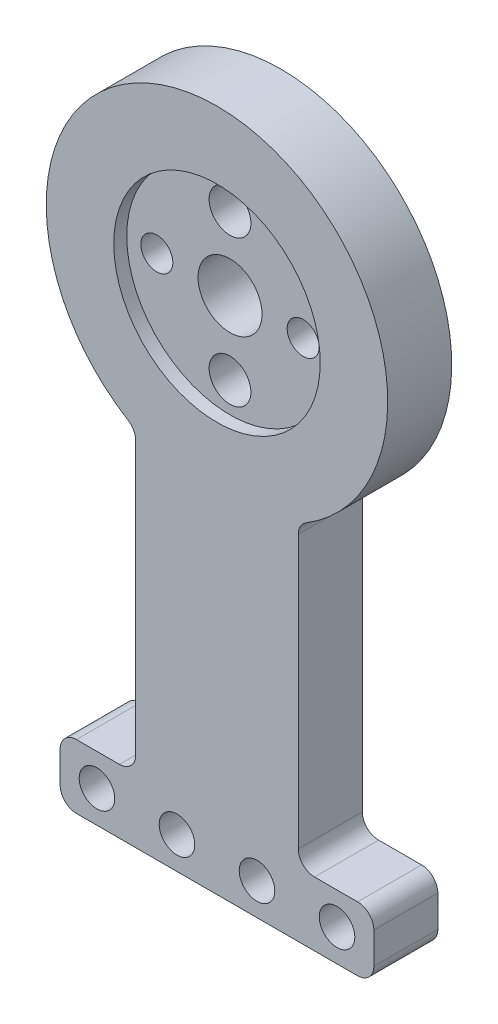
ISO-10303-21;
HEADER;
FILE_DESCRIPTION(('STEP AP214'),'2;1');
FILE_NAME('part.step','',(''),(''),'','','');
FILE_SCHEMA(('AUTOMOTIVE_DESIGN { 1 0 10303 214 1 1 1 1 }'));
ENDSEC;
DATA;
#1=APPLICATION_CONTEXT('core data for automotive mechanical design processes');
#2=APPLICATION_PROTOCOL_DEFINITION('international standard','automotive_design',2000,#1);
#3=PRODUCT_CONTEXT('',#1,'mechanical');
#4=PRODUCT('Part','Part','',(#3));
#5=PRODUCT_RELATED_PRODUCT_CATEGORY('part','',(#4));
#6=PRODUCT_DEFINITION_FORMATION('','',#4);
#7=PRODUCT_DEFINITION_CONTEXT('part definition',#1,'design');
#8=PRODUCT_DEFINITION('design','',#6,#7);
#9=PRODUCT_DEFINITION_SHAPE('','',#8);
#10=(LENGTH_UNIT() NAMED_UNIT(*) SI_UNIT(.MILLI.,.METRE.));
#11=(NAMED_UNIT(*) PLANE_ANGLE_UNIT() SI_UNIT($,.RADIAN.));
#12=(NAMED_UNIT(*) SI_UNIT($,.STERADIAN.) SOLID_ANGLE_UNIT());
#13=UNCERTAINTY_MEASURE_WITH_UNIT(LENGTH_MEASURE(1.E-05),#10,'distance_accuracy_value','');
#14=(GEOMETRIC_REPRESENTATION_CONTEXT(3) GLOBAL_UNCERTAINTY_ASSIGNED_CONTEXT((#13)) GLOBAL_UNIT_ASSIGNED_CONTEXT((#10,
#11,#12)) REPRESENTATION_CONTEXT('',''));
#15=CARTESIAN_POINT('',(0.,0.,0.));
#16=DIRECTION('',(0.,0.,1.));
#17=DIRECTION('',(1.,0.,0.));
#18=AXIS2_PLACEMENT_3D('',#15,#16,#17);
#19=CARTESIAN_POINT('',(0.,0.,-4.9999999949));
#20=DIRECTION('',(0.,0.,1.));
#21=DIRECTION('',(1.,0.,0.));
#22=AXIS2_PLACEMENT_3D('',#19,#20,#21);
#23=PLANE('',#22);
#24=CARTESIAN_POINT('',(-18.749999584,-75.009999967,-4.9999999949));
#25=DIRECTION('',(0.,0.,-1.));
#26=DIRECTION('',(-1.,0.,0.));
#27=AXIS2_PLACEMENT_3D('',#24,#25,#26);
#28=CIRCLE('',#27,2.77812499999999);
#29=CARTESIAN_POINT('',(-21.528124584,-75.009999967,-4.9999999949));
#30=VERTEX_POINT('',#29);
#31=EDGE_CURVE('E394',#30,#30,#28,.T.);
#32=ORIENTED_EDGE('',*,*,#31,.F.);
#33=EDGE_LOOP('',(#32));
#34=FACE_BOUND('',#33,.T.);
#35=DIRECTION('',(0.,1.,0.));
#36=VECTOR('',#35,1.);
#37=CARTESIAN_POINT('',(24.500000022,-80.01,-4.9999999949));
#38=LINE('',#37,#36);
#39=CARTESIAN_POINT('',(24.500000022,-77.47,-4.9999999949));
#40=VERTEX_POINT('',#39);
#41=CARTESIAN_POINT('',(24.500000022,-72.549999934,-4.9999999949));
#42=VERTEX_POINT('',#41);
#43=EDGE_CURVE('E406',#40,#42,#38,.T.);
#44=ORIENTED_EDGE('',*,*,#43,.F.);
#45=CARTESIAN_POINT('',(21.960000022,-77.47,-4.9999999949));
#46=DIRECTION('',(0.,0.,1.));
#47=DIRECTION('',(1.,0.,0.));
#48=AXIS2_PLACEMENT_3D('',#45,#46,#47);
#49=CIRCLE('',#48,2.54);
#50=CARTESIAN_POINT('',(21.960000022,-80.01,-4.9999999949));
#51=VERTEX_POINT('',#50);
#52=EDGE_CURVE('E338',#40,#51,#49,.F.);
#53=ORIENTED_EDGE('',*,*,#52,.T.);
#54=DIRECTION('',(1.,0.,0.));
#55=VECTOR('',#54,1.);
#56=CARTESIAN_POINT('',(-12.7,-80.01,-4.9999999949));
#57=LINE('',#56,#55);
#58=CARTESIAN_POINT('',(-21.960000022,-80.01,-4.9999999949));
#59=VERTEX_POINT('',#58);
#60=EDGE_CURVE('E222',#59,#51,#57,.T.);
#61=ORIENTED_EDGE('',*,*,#60,.F.);
#62=CARTESIAN_POINT('',(-21.960000022,-77.47,-4.9999999949));
#63=DIRECTION('',(0.,0.,1.));
#64=DIRECTION('',(1.,0.,0.));
#65=AXIS2_PLACEMENT_3D('',#62,#63,#64);
#66=CIRCLE('',#65,2.54);
#67=CARTESIAN_POINT('',(-24.500000022,-77.47,-4.9999999949));
#68=VERTEX_POINT('',#67);
#69=EDGE_CURVE('E336',#59,#68,#66,.F.);
#70=ORIENTED_EDGE('',*,*,#69,.T.);
#71=DIRECTION('',(0.,1.,0.));
#72=VECTOR('',#71,1.);
#73=CARTESIAN_POINT('',(-24.500000022,-80.01,-4.9999999949));
#74=LINE('',#73,#72);
#75=CARTESIAN_POINT('',(-24.500000022,-72.549999934,-4.9999999949));
#76=VERTEX_POINT('',#75);
#77=EDGE_CURVE('E405',#68,#76,#74,.T.);
#78=ORIENTED_EDGE('',*,*,#77,.T.);
#79=CARTESIAN_POINT('',(-21.960000022,-72.549999934,-4.9999999949));
#80=DIRECTION('',(0.,0.,1.));
#81=DIRECTION('',(1.,0.,0.));
#82=AXIS2_PLACEMENT_3D('',#79,#80,#81);
#83=CIRCLE('',#82,2.54);
#84=CARTESIAN_POINT('',(-21.960000022,-70.009999934,-4.9999999949));
#85=VERTEX_POINT('',#84);
#86=EDGE_CURVE('E328',#76,#85,#83,.F.);
#87=ORIENTED_EDGE('',*,*,#86,.T.);
#88=DIRECTION('',(-1.,0.,0.));
#89=VECTOR('',#88,1.);
#90=CARTESIAN_POINT('',(24.500000022,-70.009999934,-4.9999999949));
#91=LINE('',#90,#89);
#92=CARTESIAN_POINT('',(-15.24,-70.009999934,-4.9999999949));
#93=VERTEX_POINT('',#92);
#94=EDGE_CURVE('E419',#93,#85,#91,.T.);
#95=ORIENTED_EDGE('',*,*,#94,.F.);
#96=CARTESIAN_POINT('',(-15.24,-67.469999934,-4.9999999949));
#97=DIRECTION('',(0.,0.,1.));
#98=DIRECTION('',(1.,0.,0.));
#99=AXIS2_PLACEMENT_3D('',#96,#97,#98);
#100=CIRCLE('',#99,2.54);
#101=CARTESIAN_POINT('',(-12.7,-67.469999934,-4.9999999949));
#102=VERTEX_POINT('',#101);
#103=EDGE_CURVE('E53',#93,#102,#100,.T.);
#104=ORIENTED_EDGE('',*,*,#103,.T.);
#105=DIRECTION('',(0.,-1.,0.));
#106=VECTOR('',#105,1.);
#107=CARTESIAN_POINT('',(-12.7,-80.01,-4.9999999949));
#108=LINE('',#107,#106);
#109=CARTESIAN_POINT('',(-12.7,-24.9191994253427,-4.9999999949));
#110=VERTEX_POINT('',#109);
#111=EDGE_CURVE('E219',#110,#102,#108,.T.);
#112=ORIENTED_EDGE('',*,*,#111,.F.);
#113=CARTESIAN_POINT('',(-15.24,-24.9191994253427,-4.9999999949));
#114=DIRECTION('',(0.,0.,1.));
#115=DIRECTION('',(1.,0.,0.));
#116=AXIS2_PLACEMENT_3D('',#113,#114,#115);
#117=CIRCLE('',#116,2.54);
#118=CARTESIAN_POINT('',(-13.9147826086956,-22.7523125187911,-4.9999999949));
#119=VERTEX_POINT('',#118);
#120=EDGE_CURVE('E372',#110,#119,#117,.T.);
#121=ORIENTED_EDGE('',*,*,#120,.T.);
#122=CARTESIAN_POINT('',(0.,0.,-4.9999999949));
#123=DIRECTION('',(0.,0.,1.));
#124=DIRECTION('',(1.,0.,0.));
#125=AXIS2_PLACEMENT_3D('',#122,#123,#124);
#126=CIRCLE('',#125,26.67);
#127=CARTESIAN_POINT('',(13.9147826086957,-22.7523125187911,-4.9999999949));
#128=VERTEX_POINT('',#127);
#129=EDGE_CURVE('E196',#128,#119,#126,.T.);
#130=ORIENTED_EDGE('',*,*,#129,.F.);
#131=CARTESIAN_POINT('',(15.24,-24.9191994253427,-4.9999999949));
#132=DIRECTION('',(0.,0.,1.));
#133=DIRECTION('',(1.,0.,0.));
#134=AXIS2_PLACEMENT_3D('',#131,#132,#133);
#135=CIRCLE('',#134,2.54);
#136=CARTESIAN_POINT('',(12.7,-24.9191994253427,-4.9999999949));
#137=VERTEX_POINT('',#136);
#138=EDGE_CURVE('E368',#128,#137,#135,.T.);
#139=ORIENTED_EDGE('',*,*,#138,.T.);
#140=DIRECTION('',(0.,1.,0.));
#141=VECTOR('',#140,1.);
#142=CARTESIAN_POINT('',(12.7,-80.01,-4.9999999949));
#143=LINE('',#142,#141);
#144=CARTESIAN_POINT('',(12.7,-67.469999934,-4.9999999949));
#145=VERTEX_POINT('',#144);
#146=EDGE_CURVE('E208',#145,#137,#143,.T.);
#147=ORIENTED_EDGE('',*,*,#146,.F.);
#148=CARTESIAN_POINT('',(15.24,-67.469999934,-4.9999999949));
#149=DIRECTION('',(0.,0.,1.));
#150=DIRECTION('',(1.,0.,0.));
#151=AXIS2_PLACEMENT_3D('',#148,#149,#150);
#152=CIRCLE('',#151,2.54);
#153=CARTESIAN_POINT('',(15.24,-70.009999934,-4.9999999949));
#154=VERTEX_POINT('',#153);
#155=EDGE_CURVE('E378',#145,#154,#152,.T.);
#156=ORIENTED_EDGE('',*,*,#155,.T.);
#157=CARTESIAN_POINT('',(21.960000022,-70.009999934,-4.9999999949));
#158=VERTEX_POINT('',#157);
#159=EDGE_CURVE('E189',#158,#154,#91,.T.);
#160=ORIENTED_EDGE('',*,*,#159,.F.);
#161=CARTESIAN_POINT('',(21.960000022,-72.549999934,-4.9999999949));
#162=DIRECTION('',(0.,0.,1.));
#163=DIRECTION('',(1.,0.,0.));
#164=AXIS2_PLACEMENT_3D('',#161,#162,#163);
#165=CIRCLE('',#164,2.54);
#166=EDGE_CURVE('E335',#158,#42,#165,.F.);
#167=ORIENTED_EDGE('',*,*,#166,.T.);
#168=EDGE_LOOP('',(#44,#53,#61,#70,#78,#87,#95,#104,#112,#121,#130,#139,#147,#156,#160,#167));
#169=FACE_BOUND('',#168,.T.);
#170=CARTESIAN_POINT('',(0.,11.43,-4.9999999949));
#171=DIRECTION('',(0.,0.,-1.));
#172=DIRECTION('',(-1.,0.,0.));
#173=AXIS2_PLACEMENT_3D('',#170,#171,#172);
#174=CIRCLE('',#173,6.4389);
#175=CARTESIAN_POINT('',(-0.189748286826541,4.9938964584427,-4.9999999949));
#176=VERTEX_POINT('',#175);
#177=CARTESIAN_POINT('',(0.189748286826521,4.9938964584427,-4.9999999949));
#178=VERTEX_POINT('',#177);
#179=EDGE_CURVE('E174',#176,#178,#174,.T.);
#180=ORIENTED_EDGE('',*,*,#179,.F.);
#181=CARTESIAN_POINT('',(0.,0.,-4.9999999949));
#182=DIRECTION('',(0.,0.,1.));
#183=DIRECTION('',(1.,0.,0.));
#184=AXIS2_PLACEMENT_3D('',#181,#182,#183);
#185=CIRCLE('',#184,4.9975);
#186=CARTESIAN_POINT('',(-0.189748286826061,-4.99389645844269,-4.9999999949));
#187=VERTEX_POINT('',#186);
#188=EDGE_CURVE('E185',#176,#187,#185,.T.);
#189=ORIENTED_EDGE('',*,*,#188,.T.);
#190=CARTESIAN_POINT('',(0.,-11.43,-4.9999999949));
#191=DIRECTION('',(0.,0.,-1.));
#192=DIRECTION('',(-1.,0.,0.));
#193=AXIS2_PLACEMENT_3D('',#190,#191,#192);
#194=CIRCLE('',#193,6.4389);
#195=CARTESIAN_POINT('',(0.189748286826063,-4.99389645844269,-4.9999999949));
#196=VERTEX_POINT('',#195);
#197=EDGE_CURVE('E424',#196,#187,#194,.T.);
#198=ORIENTED_EDGE('',*,*,#197,.F.);
#199=EDGE_CURVE('E187',#196,#178,#185,.T.);
#200=ORIENTED_EDGE('',*,*,#199,.T.);
#201=EDGE_LOOP('',(#180,#189,#198,#200));
#202=FACE_BOUND('',#201,.T.);
#203=CARTESIAN_POINT('',(-11.43,0.,-4.9999999949));
#204=DIRECTION('',(0.,0.,-1.));
#205=DIRECTION('',(-1.,0.,0.));
#206=AXIS2_PLACEMENT_3D('',#203,#204,#205);
#207=CIRCLE('',#206,2.5);
#208=CARTESIAN_POINT('',(-13.93,0.,-4.9999999949));
#209=VERTEX_POINT('',#208);
#210=EDGE_CURVE('E435',#209,#209,#207,.T.);
#211=ORIENTED_EDGE('',*,*,#210,.F.);
#212=EDGE_LOOP('',(#211));
#213=FACE_BOUND('',#212,.T.);
#214=CARTESIAN_POINT('',(11.43,0.,-4.9999999949));
#215=DIRECTION('',(0.,0.,-1.));
#216=DIRECTION('',(-1.,0.,0.));
#217=AXIS2_PLACEMENT_3D('',#214,#215,#216);
#218=CIRCLE('',#217,2.5);
#219=CARTESIAN_POINT('',(8.93,0.,-4.9999999949));
#220=VERTEX_POINT('',#219);
#221=EDGE_CURVE('E429',#220,#220,#218,.T.);
#222=ORIENTED_EDGE('',*,*,#221,.F.);
#223=EDGE_LOOP('',(#222));
#224=FACE_BOUND('',#223,.T.);
#225=CARTESIAN_POINT('',(18.750000092,-75.009999967,-4.9999999949));
#226=DIRECTION('',(0.,0.,-1.));
#227=DIRECTION('',(-1.,0.,0.));
#228=AXIS2_PLACEMENT_3D('',#225,#226,#227);
#229=CIRCLE('',#228,2.77812499999999);
#230=CARTESIAN_POINT('',(15.971875092,-75.009999967,-4.9999999949));
#231=VERTEX_POINT('',#230);
#232=EDGE_CURVE('E399',#231,#231,#229,.T.);
#233=ORIENTED_EDGE('',*,*,#232,.F.);
#234=EDGE_LOOP('',(#233));
#235=FACE_BOUND('',#234,.T.);
#236=CARTESIAN_POINT('',(6.2500002,-75.009999967,-4.9999999949));
#237=DIRECTION('',(0.,0.,-1.));
#238=DIRECTION('',(-1.,0.,0.));
#239=AXIS2_PLACEMENT_3D('',#236,#237,#238);
#240=CIRCLE('',#239,2.77812499999999);
#241=CARTESIAN_POINT('',(3.47187520000001,-75.009999967,-4.9999999949));
#242=VERTEX_POINT('',#241);
#243=EDGE_CURVE('E382',#242,#242,#240,.T.);
#244=ORIENTED_EDGE('',*,*,#243,.F.);
#245=EDGE_LOOP('',(#244));
#246=FACE_BOUND('',#245,.T.);
#247=CARTESIAN_POINT('',(-6.249999692,-75.009999967,-4.9999999949));
#248=DIRECTION('',(0.,0.,-1.));
#249=DIRECTION('',(-1.,0.,0.));
#250=AXIS2_PLACEMENT_3D('',#247,#248,#249);
#251=CIRCLE('',#250,2.77812499999999);
#252=CARTESIAN_POINT('',(-9.02812469199999,-75.009999967,-4.9999999949));
#253=VERTEX_POINT('',#252);
#254=EDGE_CURVE('E383',#253,#253,#251,.T.);
#255=ORIENTED_EDGE('',*,*,#254,.F.);
#256=EDGE_LOOP('',(#255));
#257=FACE_BOUND('',#256,.T.);
#258=ADVANCED_FACE('F44',(#34,#169,#202,#213,#224,#235,#246,#257),#23,.F.);
#259=CARTESIAN_POINT('',(-12.7,-80.01,4.9999999949));
#260=DIRECTION('',(1.,0.,0.));
#261=DIRECTION('',(0.,0.,-1.));
#262=AXIS2_PLACEMENT_3D('',#259,#260,#261);
#263=PLANE('',#262);
#264=DIRECTION('',(0.,-1.,0.));
#265=VECTOR('',#264,1.);
#266=CARTESIAN_POINT('',(-12.7,-80.01,4.9999999949));
#267=LINE('',#266,#265);
#268=CARTESIAN_POINT('',(-12.7,-24.9191994253427,4.9999999949));
#269=VERTEX_POINT('',#268);
#270=CARTESIAN_POINT('',(-12.7,-67.469999934,4.9999999949));
#271=VERTEX_POINT('',#270);
#272=EDGE_CURVE('E207',#269,#271,#267,.T.);
#273=ORIENTED_EDGE('',*,*,#272,.F.);
#274=DIRECTION('',(0.,0.,1.));
#275=VECTOR('',#274,1.);
#276=CARTESIAN_POINT('',(-12.7,-24.9191994253427,-4.9999999949));
#277=LINE('',#276,#275);
#278=EDGE_CURVE('E468',#269,#110,#277,.F.);
#279=ORIENTED_EDGE('',*,*,#278,.T.);
#280=ORIENTED_EDGE('',*,*,#111,.T.);
#281=DIRECTION('',(0.,0.,-1.));
#282=VECTOR('',#281,1.);
#283=CARTESIAN_POINT('',(-12.7,-67.469999934,4.9999999949));
#284=LINE('',#283,#282);
#285=EDGE_CURVE('E473',#102,#271,#284,.F.);
#286=ORIENTED_EDGE('',*,*,#285,.T.);
#287=EDGE_LOOP('',(#273,#279,#280,#286));
#288=FACE_BOUND('',#287,.T.);
#289=ADVANCED_FACE('F274',(#288),#263,.F.);
#290=CARTESIAN_POINT('',(12.7,-80.01,4.9999999949));
#291=DIRECTION('',(-1.,0.,0.));
#292=DIRECTION('',(0.,0.,1.));
#293=AXIS2_PLACEMENT_3D('',#290,#291,#292);
#294=PLANE('',#293);
#295=ORIENTED_EDGE('',*,*,#146,.T.);
#296=DIRECTION('',(0.,0.,1.));
#297=VECTOR('',#296,1.);
#298=CARTESIAN_POINT('',(12.7,-24.9191994253427,4.9999999949));
#299=LINE('',#298,#297);
#300=CARTESIAN_POINT('',(12.7,-24.9191994253427,4.9999999949));
#301=VERTEX_POINT('',#300);
#302=EDGE_CURVE('E475',#137,#301,#299,.T.);
#303=ORIENTED_EDGE('',*,*,#302,.T.);
#304=DIRECTION('',(0.,1.,0.));
#305=VECTOR('',#304,1.);
#306=CARTESIAN_POINT('',(12.7,-80.01,4.9999999949));
#307=LINE('',#306,#305);
#308=CARTESIAN_POINT('',(12.7,-67.469999934,4.9999999949));
#309=VERTEX_POINT('',#308);
#310=EDGE_CURVE('E214',#309,#301,#307,.T.);
#311=ORIENTED_EDGE('',*,*,#310,.F.);
#312=DIRECTION('',(0.,0.,1.));
#313=VECTOR('',#312,1.);
#314=CARTESIAN_POINT('',(12.7,-67.469999934,-4.9999999949));
#315=LINE('',#314,#313);
#316=EDGE_CURVE('E477',#309,#145,#315,.F.);
#317=ORIENTED_EDGE('',*,*,#316,.T.);
#318=EDGE_LOOP('',(#295,#303,#311,#317));
#319=FACE_BOUND('',#318,.T.);
#320=ADVANCED_FACE('F280',(#319),#294,.F.);
#321=CARTESIAN_POINT('',(0.,0.,4.9999999949));
#322=DIRECTION('',(0.,0.,-1.));
#323=DIRECTION('',(-1.,0.,0.));
#324=AXIS2_PLACEMENT_3D('',#321,#322,#323);
#325=CYLINDRICAL_SURFACE('',#324,4.9975);
#326=CARTESIAN_POINT('',(0.193249810186751,4.99376218505276,-5.0001999949));
#327=CARTESIAN_POINT('',(0.128833206791168,4.99625406168426,-4.9964865031403));
#328=CARTESIAN_POINT('',(0.0644166033955848,4.99750000000001,-4.99462975726045));
#329=CARTESIAN_POINT('',(-0.0644166033955817,4.99750000000001,-4.99462975726045));
#330=CARTESIAN_POINT('',(-0.128833206791165,4.99625406168426,-4.9964865031403));
#331=CARTESIAN_POINT('',(-0.193249810186748,4.99376218505276,-5.0001999949));
#332=B_SPLINE_CURVE_WITH_KNOTS('',3,(#326,#327,#328,#329,#330,#331),.UNSPECIFIED.,.F.,.F.,(4,2,
4),(0.,0.193366201661913,0.386732403323827),.UNSPECIFIED.);
#333=EDGE_CURVE('E170',#178,#176,#332,.T.);
#334=ORIENTED_EDGE('',*,*,#333,.F.);
#335=ORIENTED_EDGE('',*,*,#199,.F.);
#336=CARTESIAN_POINT('',(-0.193249810186299,-4.99376218505275,-5.0001999949));
#337=CARTESIAN_POINT('',(-0.128833206790865,-4.99625406168424,-4.99648650314032));
#338=CARTESIAN_POINT('',(-0.0644166033954313,-4.99749999999998,-4.99462975726048));
#339=CARTESIAN_POINT('',(0.0644166033954368,-4.99749999999998,-4.99462975726048));
#340=CARTESIAN_POINT('',(0.128833206790871,-4.99625406168424,-4.99648650314032));
#341=CARTESIAN_POINT('',(0.193249810186305,-4.99376218505275,-5.0001999949));
#342=B_SPLINE_CURVE_WITH_KNOTS('',3,(#336,#337,#338,#339,#340,#341),.UNSPECIFIED.,.F.,.F.,(4,2,
4),(0.,0.193366201661465,0.38673240332293),.UNSPECIFIED.);
#343=EDGE_CURVE('E180',#187,#196,#342,.T.);
#344=ORIENTED_EDGE('',*,*,#343,.F.);
#345=ORIENTED_EDGE('',*,*,#188,.F.);
#346=EDGE_LOOP('',(#334,#335,#344,#345));
#347=FACE_BOUND('',#346,.T.);
#348=CARTESIAN_POINT('',(0.,0.,2.9679999949));
#349=DIRECTION('',(0.,0.,1.));
#350=DIRECTION('',(1.,0.,0.));
#351=AXIS2_PLACEMENT_3D('',#348,#349,#350);
#352=CIRCLE('',#351,4.9975);
#353=CARTESIAN_POINT('',(4.9975,0.,2.9679999949));
#354=VERTEX_POINT('',#353);
#355=EDGE_CURVE('E194',#354,#354,#352,.T.);
#356=ORIENTED_EDGE('',*,*,#355,.T.);
#357=EDGE_LOOP('',(#356));
#358=FACE_BOUND('',#357,.T.);
#359=ADVANCED_FACE('F192',(#347,#358),#325,.F.);
#360=CARTESIAN_POINT('',(0.,0.,4.9999999949));
#361=DIRECTION('',(0.,0.,1.));
#362=DIRECTION('',(1.,0.,0.));
#363=AXIS2_PLACEMENT_3D('',#360,#361,#362);
#364=PLANE('',#363);
#365=CARTESIAN_POINT('',(-18.749999584,-75.009999967,4.9999999949));
#366=DIRECTION('',(0.,0.,1.));
#367=DIRECTION('',(1.,0.,0.));
#368=AXIS2_PLACEMENT_3D('',#365,#366,#367);
#369=CIRCLE('',#368,2.77812499999999);
#370=CARTESIAN_POINT('',(-15.971874584,-75.009999967,4.9999999949));
#371=VERTEX_POINT('',#370);
#372=EDGE_CURVE('E48',#371,#371,#369,.T.);
#373=ORIENTED_EDGE('',*,*,#372,.F.);
#374=EDGE_LOOP('',(#373));
#375=FACE_BOUND('',#374,.T.);
#376=CARTESIAN_POINT('',(-6.249999692,-75.009999967,4.9999999949));
#377=DIRECTION('',(0.,0.,1.));
#378=DIRECTION('',(1.,0.,0.));
#379=AXIS2_PLACEMENT_3D('',#376,#377,#378);
#380=CIRCLE('',#379,2.77812499999999);
#381=CARTESIAN_POINT('',(-3.47187469200001,-75.009999967,4.9999999949));
#382=VERTEX_POINT('',#381);
#383=EDGE_CURVE('E380',#382,#382,#380,.T.);
#384=ORIENTED_EDGE('',*,*,#383,.F.);
#385=EDGE_LOOP('',(#384));
#386=FACE_BOUND('',#385,.T.);
#387=CARTESIAN_POINT('',(6.2500002,-75.009999967,4.9999999949));
#388=DIRECTION('',(0.,0.,1.));
#389=DIRECTION('',(1.,0.,0.));
#390=AXIS2_PLACEMENT_3D('',#387,#388,#389);
#391=CIRCLE('',#390,2.77812499999999);
#392=CARTESIAN_POINT('',(9.02812519999999,-75.009999967,4.9999999949));
#393=VERTEX_POINT('',#392);
#394=EDGE_CURVE('E387',#393,#393,#391,.T.);
#395=ORIENTED_EDGE('',*,*,#394,.F.);
#396=EDGE_LOOP('',(#395));
#397=FACE_BOUND('',#396,.T.);
#398=CARTESIAN_POINT('',(18.750000092,-75.009999967,4.9999999949));
#399=DIRECTION('',(0.,0.,1.));
#400=DIRECTION('',(1.,0.,0.));
#401=AXIS2_PLACEMENT_3D('',#398,#399,#400);
#402=CIRCLE('',#401,2.77812499999999);
#403=CARTESIAN_POINT('',(21.528125092,-75.009999967,4.9999999949));
#404=VERTEX_POINT('',#403);
#405=EDGE_CURVE('E402',#404,#404,#402,.T.);
#406=ORIENTED_EDGE('',*,*,#405,.F.);
#407=EDGE_LOOP('',(#406));
#408=FACE_BOUND('',#407,.T.);
#409=DIRECTION('',(1.,0.,0.));
#410=VECTOR('',#409,1.);
#411=CARTESIAN_POINT('',(-12.7,-80.01,4.9999999949));
#412=LINE('',#411,#410);
#413=CARTESIAN_POINT('',(-21.960000022,-80.01,4.9999999949));
#414=VERTEX_POINT('',#413);
#415=CARTESIAN_POINT('',(21.960000022,-80.01,4.9999999949));
#416=VERTEX_POINT('',#415);
#417=EDGE_CURVE('E211',#414,#416,#412,.T.);
#418=ORIENTED_EDGE('',*,*,#417,.T.);
#419=CARTESIAN_POINT('',(21.960000022,-77.47,4.9999999949));
#420=DIRECTION('',(0.,0.,1.));
#421=DIRECTION('',(1.,0.,0.));
#422=AXIS2_PLACEMENT_3D('',#419,#420,#421);
#423=CIRCLE('',#422,2.54);
#424=CARTESIAN_POINT('',(24.500000022,-77.47,4.9999999949));
#425=VERTEX_POINT('',#424);
#426=EDGE_CURVE('E355',#416,#425,#423,.T.);
#427=ORIENTED_EDGE('',*,*,#426,.T.);
#428=DIRECTION('',(0.,-1.,0.));
#429=VECTOR('',#428,1.);
#430=CARTESIAN_POINT('',(24.500000022,-80.01,4.9999999949));
#431=LINE('',#430,#429);
#432=CARTESIAN_POINT('',(24.500000022,-72.549999934,4.9999999949));
#433=VERTEX_POINT('',#432);
#434=EDGE_CURVE('E409',#433,#425,#431,.T.);
#435=ORIENTED_EDGE('',*,*,#434,.F.);
#436=CARTESIAN_POINT('',(21.960000022,-72.549999934,4.9999999949));
#437=DIRECTION('',(0.,0.,1.));
#438=DIRECTION('',(1.,0.,0.));
#439=AXIS2_PLACEMENT_3D('',#436,#437,#438);
#440=CIRCLE('',#439,2.54);
#441=CARTESIAN_POINT('',(21.960000022,-70.009999934,4.9999999949));
#442=VERTEX_POINT('',#441);
#443=EDGE_CURVE('E353',#433,#442,#440,.T.);
#444=ORIENTED_EDGE('',*,*,#443,.T.);
#445=DIRECTION('',(-1.,0.,0.));
#446=VECTOR('',#445,1.);
#447=CARTESIAN_POINT('',(24.500000022,-70.009999934,4.9999999949));
#448=LINE('',#447,#446);
#449=CARTESIAN_POINT('',(15.24,-70.009999934,4.9999999949));
#450=VERTEX_POINT('',#449);
#451=EDGE_CURVE('E417',#442,#450,#448,.T.);
#452=ORIENTED_EDGE('',*,*,#451,.T.);
#453=CARTESIAN_POINT('',(15.24,-67.469999934,4.9999999949));
#454=DIRECTION('',(0.,0.,1.));
#455=DIRECTION('',(1.,0.,0.));
#456=AXIS2_PLACEMENT_3D('',#453,#454,#455);
#457=CIRCLE('',#456,2.54);
#458=EDGE_CURVE('E376',#450,#309,#457,.F.);
#459=ORIENTED_EDGE('',*,*,#458,.T.);
#460=ORIENTED_EDGE('',*,*,#310,.T.);
#461=CARTESIAN_POINT('',(15.24,-24.9191994253427,4.9999999949));
#462=DIRECTION('',(0.,0.,1.));
#463=DIRECTION('',(1.,0.,0.));
#464=AXIS2_PLACEMENT_3D('',#461,#462,#463);
#465=CIRCLE('',#464,2.54);
#466=CARTESIAN_POINT('',(13.9147826086957,-22.7523125187911,4.9999999949));
#467=VERTEX_POINT('',#466);
#468=EDGE_CURVE('E370',#301,#467,#465,.F.);
#469=ORIENTED_EDGE('',*,*,#468,.T.);
#470=CARTESIAN_POINT('',(0.,0.,4.9999999949));
#471=DIRECTION('',(0.,0.,1.));
#472=DIRECTION('',(1.,0.,0.));
#473=AXIS2_PLACEMENT_3D('',#470,#471,#472);
#474=CIRCLE('',#473,26.67);
#475=CARTESIAN_POINT('',(-13.9147826086956,-22.7523125187911,4.9999999949));
#476=VERTEX_POINT('',#475);
#477=EDGE_CURVE('E204',#467,#476,#474,.T.);
#478=ORIENTED_EDGE('',*,*,#477,.T.);
#479=CARTESIAN_POINT('',(-15.24,-24.9191994253427,4.9999999949));
#480=DIRECTION('',(0.,0.,1.));
#481=DIRECTION('',(1.,0.,0.));
#482=AXIS2_PLACEMENT_3D('',#479,#480,#481);
#483=CIRCLE('',#482,2.54);
#484=EDGE_CURVE('E374',#476,#269,#483,.F.);
#485=ORIENTED_EDGE('',*,*,#484,.T.);
#486=ORIENTED_EDGE('',*,*,#272,.T.);
#487=CARTESIAN_POINT('',(-15.24,-67.469999934,4.9999999949));
#488=DIRECTION('',(0.,0.,1.));
#489=DIRECTION('',(1.,0.,0.));
#490=AXIS2_PLACEMENT_3D('',#487,#488,#489);
#491=CIRCLE('',#490,2.54);
#492=CARTESIAN_POINT('',(-15.24,-70.009999934,4.9999999949));
#493=VERTEX_POINT('',#492);
#494=EDGE_CURVE('E11',#271,#493,#491,.F.);
#495=ORIENTED_EDGE('',*,*,#494,.T.);
#496=CARTESIAN_POINT('',(-21.960000022,-70.009999934,4.9999999949));
#497=VERTEX_POINT('',#496);
#498=EDGE_CURVE('E413',#493,#497,#448,.T.);
#499=ORIENTED_EDGE('',*,*,#498,.T.);
#500=CARTESIAN_POINT('',(-21.960000022,-72.549999934,4.9999999949));
#501=DIRECTION('',(0.,0.,1.));
#502=DIRECTION('',(1.,0.,0.));
#503=AXIS2_PLACEMENT_3D('',#500,#501,#502);
#504=CIRCLE('',#503,2.54);
#505=CARTESIAN_POINT('',(-24.500000022,-72.549999934,4.9999999949));
#506=VERTEX_POINT('',#505);
#507=EDGE_CURVE('E68',#497,#506,#504,.T.);
#508=ORIENTED_EDGE('',*,*,#507,.T.);
#509=DIRECTION('',(0.,-1.,0.));
#510=VECTOR('',#509,1.);
#511=CARTESIAN_POINT('',(-24.500000022,-80.01,4.9999999949));
#512=LINE('',#511,#510);
#513=CARTESIAN_POINT('',(-24.500000022,-77.47,4.9999999949));
#514=VERTEX_POINT('',#513);
#515=EDGE_CURVE('E410',#506,#514,#512,.T.);
#516=ORIENTED_EDGE('',*,*,#515,.T.);
#517=CARTESIAN_POINT('',(-21.960000022,-77.47,4.9999999949));
#518=DIRECTION('',(0.,0.,1.));
#519=DIRECTION('',(1.,0.,0.));
#520=AXIS2_PLACEMENT_3D('',#517,#518,#519);
#521=CIRCLE('',#520,2.54);
#522=EDGE_CURVE('E350',#514,#414,#521,.T.);
#523=ORIENTED_EDGE('',*,*,#522,.T.);
#524=EDGE_LOOP('',(#418,#427,#435,#444,#452,#459,#460,#469,#478,#485,#486,#495,#499,#508,#516,#523));
#525=FACE_BOUND('',#524,.T.);
#526=CARTESIAN_POINT('',(0.,0.,4.9999999949));
#527=DIRECTION('',(0.,0.,1.));
#528=DIRECTION('',(1.,0.,0.));
#529=AXIS2_PLACEMENT_3D('',#526,#527,#528);
#530=CIRCLE('',#529,16.129);
#531=CARTESIAN_POINT('',(16.129,0.,4.9999999949));
#532=VERTEX_POINT('',#531);
#533=EDGE_CURVE('E202',#532,#532,#530,.T.);
#534=ORIENTED_EDGE('',*,*,#533,.F.);
#535=EDGE_LOOP('',(#534));
#536=FACE_BOUND('',#535,.T.);
#537=ADVANCED_FACE('F286',(#375,#386,#397,#408,#525,#536),#364,.T.);
#538=CARTESIAN_POINT('',(0.,0.,4.9999999949));
#539=DIRECTION('',(0.,0.,-1.));
#540=DIRECTION('',(-1.,0.,0.));
#541=AXIS2_PLACEMENT_3D('',#538,#539,#540);
#542=CYLINDRICAL_SURFACE('',#541,26.67);
#543=ORIENTED_EDGE('',*,*,#477,.F.);
#544=DIRECTION('',(0.,0.,-1.));
#545=VECTOR('',#544,1.);
#546=CARTESIAN_POINT('',(13.9147826086957,-22.7523125187911,4.9999999949));
#547=LINE('',#546,#545);
#548=EDGE_CURVE('E479',#467,#128,#547,.T.);
#549=ORIENTED_EDGE('',*,*,#548,.T.);
#550=ORIENTED_EDGE('',*,*,#129,.T.);
#551=DIRECTION('',(0.,0.,-1.));
#552=VECTOR('',#551,1.);
#553=CARTESIAN_POINT('',(-13.9147826086956,-22.7523125187911,4.9999999949));
#554=LINE('',#553,#552);
#555=EDGE_CURVE('E179',#119,#476,#554,.F.);
#556=ORIENTED_EDGE('',*,*,#555,.T.);
#557=EDGE_LOOP('',(#543,#549,#550,#556));
#558=FACE_BOUND('',#557,.T.);
#559=ADVANCED_FACE('F268',(#558),#542,.T.);
#560=CARTESIAN_POINT('',(-12.7,-80.01,4.9999999949));
#561=DIRECTION('',(0.,1.,0.));
#562=DIRECTION('',(0.,0.,1.));
#563=AXIS2_PLACEMENT_3D('',#560,#561,#562);
#564=PLANE('',#563);
#565=ORIENTED_EDGE('',*,*,#60,.T.);
#566=DIRECTION('',(0.,0.,-1.));
#567=VECTOR('',#566,1.);
#568=CARTESIAN_POINT('',(21.960000022,-80.01,4.9999999949));
#569=LINE('',#568,#567);
#570=EDGE_CURVE('E348',#51,#416,#569,.F.);
#571=ORIENTED_EDGE('',*,*,#570,.T.);
#572=ORIENTED_EDGE('',*,*,#417,.F.);
#573=DIRECTION('',(0.,0.,-1.));
#574=VECTOR('',#573,1.);
#575=CARTESIAN_POINT('',(-21.960000022,-80.01,4.9999999949));
#576=LINE('',#575,#574);
#577=EDGE_CURVE('E345',#414,#59,#576,.T.);
#578=ORIENTED_EDGE('',*,*,#577,.T.);
#579=EDGE_LOOP('',(#565,#571,#572,#578));
#580=FACE_BOUND('',#579,.T.);
#581=ADVANCED_FACE('F263',(#580),#564,.F.);
#582=CARTESIAN_POINT('',(0.,0.,2.9679999949));
#583=DIRECTION('',(0.,0.,1.));
#584=DIRECTION('',(1.,0.,0.));
#585=AXIS2_PLACEMENT_3D('',#582,#583,#584);
#586=CYLINDRICAL_SURFACE('',#585,16.129);
#587=CARTESIAN_POINT('',(0.,0.,2.9679999949));
#588=DIRECTION('',(0.,0.,1.));
#589=DIRECTION('',(1.,0.,0.));
#590=AXIS2_PLACEMENT_3D('',#587,#588,#589);
#591=CIRCLE('',#590,16.129);
#592=CARTESIAN_POINT('',(16.129,0.,2.9679999949));
#593=VERTEX_POINT('',#592);
#594=EDGE_CURVE('E198',#593,#593,#591,.T.);
#595=ORIENTED_EDGE('',*,*,#594,.F.);
#596=EDGE_LOOP('',(#595));
#597=FACE_BOUND('',#596,.T.);
#598=ORIENTED_EDGE('',*,*,#533,.T.);
#599=EDGE_LOOP('',(#598));
#600=FACE_BOUND('',#599,.T.);
#601=ADVANCED_FACE('F260',(#597,#600),#586,.F.);
#602=CARTESIAN_POINT('',(0.,0.,2.9679999949));
#603=DIRECTION('',(0.,0.,1.));
#604=DIRECTION('',(1.,0.,0.));
#605=AXIS2_PLACEMENT_3D('',#602,#603,#604);
#606=PLANE('',#605);
#607=CARTESIAN_POINT('',(0.,11.43,2.9679999949));
#608=DIRECTION('',(0.,0.,1.));
#609=DIRECTION('',(1.,0.,0.));
#610=AXIS2_PLACEMENT_3D('',#607,#608,#609);
#611=CIRCLE('',#610,3.26389999999999);
#612=CARTESIAN_POINT('',(3.26389999999999,11.43,2.9679999949));
#613=VERTEX_POINT('',#612);
#614=EDGE_CURVE('E423',#613,#613,#611,.T.);
#615=ORIENTED_EDGE('',*,*,#614,.F.);
#616=EDGE_LOOP('',(#615));
#617=FACE_BOUND('',#616,.T.);
#618=CARTESIAN_POINT('',(0.,-11.43,2.9679999949));
#619=DIRECTION('',(0.,0.,1.));
#620=DIRECTION('',(1.,0.,0.));
#621=AXIS2_PLACEMENT_3D('',#618,#619,#620);
#622=CIRCLE('',#621,3.26389999999999);
#623=CARTESIAN_POINT('',(3.26389999999999,-11.43,2.9679999949));
#624=VERTEX_POINT('',#623);
#625=EDGE_CURVE('E234',#624,#624,#622,.T.);
#626=ORIENTED_EDGE('',*,*,#625,.F.);
#627=EDGE_LOOP('',(#626));
#628=FACE_BOUND('',#627,.T.);
#629=CARTESIAN_POINT('',(11.43,0.,2.9679999949));
#630=DIRECTION('',(0.,0.,1.));
#631=DIRECTION('',(1.,0.,0.));
#632=AXIS2_PLACEMENT_3D('',#629,#630,#631);
#633=CIRCLE('',#632,2.5);
#634=CARTESIAN_POINT('',(13.93,0.,2.9679999949));
#635=VERTEX_POINT('',#634);
#636=EDGE_CURVE('E432',#635,#635,#633,.T.);
#637=ORIENTED_EDGE('',*,*,#636,.F.);
#638=EDGE_LOOP('',(#637));
#639=FACE_BOUND('',#638,.T.);
#640=CARTESIAN_POINT('',(-11.43,0.,2.9679999949));
#641=DIRECTION('',(0.,0.,1.));
#642=DIRECTION('',(1.,0.,0.));
#643=AXIS2_PLACEMENT_3D('',#640,#641,#642);
#644=CIRCLE('',#643,2.5);
#645=CARTESIAN_POINT('',(-8.93,0.,2.9679999949));
#646=VERTEX_POINT('',#645);
#647=EDGE_CURVE('E438',#646,#646,#644,.T.);
#648=ORIENTED_EDGE('',*,*,#647,.F.);
#649=EDGE_LOOP('',(#648));
#650=FACE_BOUND('',#649,.T.);
#651=ORIENTED_EDGE('',*,*,#355,.F.);
#652=EDGE_LOOP('',(#651));
#653=FACE_BOUND('',#652,.T.);
#654=ORIENTED_EDGE('',*,*,#594,.T.);
#655=EDGE_LOOP('',(#654));
#656=FACE_BOUND('',#655,.T.);
#657=ADVANCED_FACE('F257',(#617,#628,#639,#650,#653,#656),#606,.T.);
#658=CARTESIAN_POINT('',(-11.43,0.,-4.9999999949));
#659=DIRECTION('',(0.,0.,-1.));
#660=DIRECTION('',(-1.,0.,0.));
#661=AXIS2_PLACEMENT_3D('',#658,#659,#660);
#662=CYLINDRICAL_SURFACE('',#661,2.5);
#663=ORIENTED_EDGE('',*,*,#647,.T.);
#664=EDGE_LOOP('',(#663));
#665=FACE_BOUND('',#664,.T.);
#666=ORIENTED_EDGE('',*,*,#210,.T.);
#667=EDGE_LOOP('',(#666));
#668=FACE_BOUND('',#667,.T.);
#669=ADVANCED_FACE('F253',(#665,#668),#662,.F.);
#670=CARTESIAN_POINT('',(11.43,0.,-4.9999999949));
#671=DIRECTION('',(0.,0.,-1.));
#672=DIRECTION('',(-1.,0.,0.));
#673=AXIS2_PLACEMENT_3D('',#670,#671,#672);
#674=CYLINDRICAL_SURFACE('',#673,2.5);
#675=ORIENTED_EDGE('',*,*,#636,.T.);
#676=EDGE_LOOP('',(#675));
#677=FACE_BOUND('',#676,.T.);
#678=ORIENTED_EDGE('',*,*,#221,.T.);
#679=EDGE_LOOP('',(#678));
#680=FACE_BOUND('',#679,.T.);
#681=ADVANCED_FACE('F249',(#677,#680),#674,.F.);
#682=CARTESIAN_POINT('',(0.,-11.43,-4.9999999949));
#683=DIRECTION('',(0.,0.,-1.));
#684=DIRECTION('',(-1.,0.,0.));
#685=AXIS2_PLACEMENT_3D('',#682,#683,#684);
#686=CYLINDRICAL_SURFACE('',#685,3.26389999999999);
#687=ORIENTED_EDGE('',*,*,#625,.T.);
#688=EDGE_LOOP('',(#687));
#689=FACE_BOUND('',#688,.T.);
#690=CARTESIAN_POINT('',(0.,-11.43,-2.33585866591213));
#691=DIRECTION('',(0.,0.,-1.));
#692=DIRECTION('',(-1.,0.,0.));
#693=AXIS2_PLACEMENT_3D('',#690,#691,#692);
#694=CIRCLE('',#693,3.2639);
#695=CARTESIAN_POINT('',(-3.2639,-11.43,-2.33585866591213));
#696=VERTEX_POINT('',#695);
#697=EDGE_CURVE('E426',#696,#696,#694,.T.);
#698=ORIENTED_EDGE('',*,*,#697,.T.);
#699=EDGE_LOOP('',(#698));
#700=FACE_BOUND('',#699,.T.);
#701=ADVANCED_FACE('F244',(#689,#700),#686,.F.);
#702=CARTESIAN_POINT('',(0.,-11.43,-4.9999999949));
#703=DIRECTION('',(0.,0.,-1.));
#704=DIRECTION('',(-1.,0.,0.));
#705=AXIS2_PLACEMENT_3D('',#702,#703,#704);
#706=CONICAL_SURFACE('',#705,6.4389,0.872664625997165);
#707=ORIENTED_EDGE('',*,*,#343,.T.);
#708=ORIENTED_EDGE('',*,*,#197,.T.);
#709=EDGE_LOOP('',(#707,#708));
#710=FACE_BOUND('',#709,.T.);
#711=ORIENTED_EDGE('',*,*,#697,.F.);
#712=EDGE_LOOP('',(#711));
#713=FACE_BOUND('',#712,.T.);
#714=ADVANCED_FACE('F238',(#710,#713),#706,.F.);
#715=CARTESIAN_POINT('',(0.,11.43,-4.9999999949));
#716=DIRECTION('',(0.,0.,-1.));
#717=DIRECTION('',(-1.,0.,0.));
#718=AXIS2_PLACEMENT_3D('',#715,#716,#717);
#719=CYLINDRICAL_SURFACE('',#718,3.26389999999999);
#720=ORIENTED_EDGE('',*,*,#614,.T.);
#721=EDGE_LOOP('',(#720));
#722=FACE_BOUND('',#721,.T.);
#723=CARTESIAN_POINT('',(0.,11.43,-2.33585866591213));
#724=DIRECTION('',(0.,0.,-1.));
#725=DIRECTION('',(-1.,0.,0.));
#726=AXIS2_PLACEMENT_3D('',#723,#724,#725);
#727=CIRCLE('',#726,3.2639);
#728=CARTESIAN_POINT('',(-3.2639,11.43,-2.33585866591213));
#729=VERTEX_POINT('',#728);
#730=EDGE_CURVE('E188',#729,#729,#727,.T.);
#731=ORIENTED_EDGE('',*,*,#730,.T.);
#732=EDGE_LOOP('',(#731));
#733=FACE_BOUND('',#732,.T.);
#734=ADVANCED_FACE('F243',(#722,#733),#719,.F.);
#735=CARTESIAN_POINT('',(0.,11.43,-4.9999999949));
#736=DIRECTION('',(0.,0.,-1.));
#737=DIRECTION('',(-1.,0.,0.));
#738=AXIS2_PLACEMENT_3D('',#735,#736,#737);
#739=CONICAL_SURFACE('',#738,6.4389,0.872664625997165);
#740=ORIENTED_EDGE('',*,*,#333,.T.);
#741=ORIENTED_EDGE('',*,*,#179,.T.);
#742=EDGE_LOOP('',(#740,#741));
#743=FACE_BOUND('',#742,.T.);
#744=ORIENTED_EDGE('',*,*,#730,.F.);
#745=EDGE_LOOP('',(#744));
#746=FACE_BOUND('',#745,.T.);
#747=ADVANCED_FACE('F172',(#743,#746),#739,.F.);
#748=CARTESIAN_POINT('',(24.500000022,0.,0.));
#749=DIRECTION('',(1.,0.,0.));
#750=DIRECTION('',(0.,0.,-1.));
#751=AXIS2_PLACEMENT_3D('',#748,#749,#750);
#752=PLANE('',#751);
#753=ORIENTED_EDGE('',*,*,#434,.T.);
#754=DIRECTION('',(0.,0.,-1.));
#755=VECTOR('',#754,1.);
#756=CARTESIAN_POINT('',(24.500000022,-77.47,-4.9999999949));
#757=LINE('',#756,#755);
#758=EDGE_CURVE('E340',#425,#40,#757,.T.);
#759=ORIENTED_EDGE('',*,*,#758,.T.);
#760=ORIENTED_EDGE('',*,*,#43,.T.);
#761=DIRECTION('',(0.,0.,1.));
#762=VECTOR('',#761,1.);
#763=CARTESIAN_POINT('',(24.500000022,-72.549999934,4.9999999949));
#764=LINE('',#763,#762);
#765=EDGE_CURVE('E466',#42,#433,#764,.T.);
#766=ORIENTED_EDGE('',*,*,#765,.T.);
#767=EDGE_LOOP('',(#753,#759,#760,#766));
#768=FACE_BOUND('',#767,.T.);
#769=ADVANCED_FACE('F491',(#768),#752,.T.);
#770=CARTESIAN_POINT('',(24.500000022,-70.009999934,-4.9999999949));
#771=DIRECTION('',(0.,-1.,0.));
#772=DIRECTION('',(0.,0.,-1.));
#773=AXIS2_PLACEMENT_3D('',#770,#771,#772);
#774=PLANE('',#773);
#775=ORIENTED_EDGE('',*,*,#451,.F.);
#776=DIRECTION('',(0.,0.,1.));
#777=VECTOR('',#776,1.);
#778=CARTESIAN_POINT('',(21.960000022,-70.009999934,-4.9999999949));
#779=LINE('',#778,#777);
#780=EDGE_CURVE('E360',#442,#158,#779,.F.);
#781=ORIENTED_EDGE('',*,*,#780,.T.);
#782=ORIENTED_EDGE('',*,*,#159,.T.);
#783=DIRECTION('',(0.,0.,1.));
#784=VECTOR('',#783,1.);
#785=CARTESIAN_POINT('',(15.24,-70.009999934,4.9999999949));
#786=LINE('',#785,#784);
#787=EDGE_CURVE('E357',#154,#450,#786,.T.);
#788=ORIENTED_EDGE('',*,*,#787,.T.);
#789=EDGE_LOOP('',(#775,#781,#782,#788));
#790=FACE_BOUND('',#789,.T.);
#791=ADVANCED_FACE('F495',(#790),#774,.F.);
#792=ORIENTED_EDGE('',*,*,#498,.F.);
#793=DIRECTION('',(0.,0.,-1.));
#794=VECTOR('',#793,1.);
#795=CARTESIAN_POINT('',(-15.24,-70.009999934,-4.9999999949));
#796=LINE('',#795,#794);
#797=EDGE_CURVE('E363',#493,#93,#796,.T.);
#798=ORIENTED_EDGE('',*,*,#797,.T.);
#799=ORIENTED_EDGE('',*,*,#94,.T.);
#800=DIRECTION('',(0.,0.,1.));
#801=VECTOR('',#800,1.);
#802=CARTESIAN_POINT('',(-21.960000022,-70.009999934,-4.9999999949));
#803=LINE('',#802,#801);
#804=EDGE_CURVE('E331',#85,#497,#803,.T.);
#805=ORIENTED_EDGE('',*,*,#804,.T.);
#806=EDGE_LOOP('',(#792,#798,#799,#805));
#807=FACE_BOUND('',#806,.T.);
#808=ADVANCED_FACE('F492',(#807),#774,.F.);
#809=CARTESIAN_POINT('',(-24.500000022,0.,0.));
#810=DIRECTION('',(1.,0.,0.));
#811=DIRECTION('',(0.,0.,-1.));
#812=AXIS2_PLACEMENT_3D('',#809,#810,#811);
#813=PLANE('',#812);
#814=ORIENTED_EDGE('',*,*,#515,.F.);
#815=DIRECTION('',(0.,0.,1.));
#816=VECTOR('',#815,1.);
#817=CARTESIAN_POINT('',(-24.500000022,-72.549999934,0.));
#818=LINE('',#817,#816);
#819=EDGE_CURVE('E329',#506,#76,#818,.F.);
#820=ORIENTED_EDGE('',*,*,#819,.T.);
#821=ORIENTED_EDGE('',*,*,#77,.F.);
#822=DIRECTION('',(0.,0.,-1.));
#823=VECTOR('',#822,1.);
#824=CARTESIAN_POINT('',(-24.500000022,-77.47,0.));
#825=LINE('',#824,#823);
#826=EDGE_CURVE('E61',#68,#514,#825,.F.);
#827=ORIENTED_EDGE('',*,*,#826,.T.);
#828=EDGE_LOOP('',(#814,#820,#821,#827));
#829=FACE_BOUND('',#828,.T.);
#830=ADVANCED_FACE('F297',(#829),#813,.F.);
#831=CARTESIAN_POINT('',(15.24,-24.9191994253427,4.9999999949));
#832=DIRECTION('',(0.,0.,-1.));
#833=DIRECTION('',(-1.,0.,0.));
#834=AXIS2_PLACEMENT_3D('',#831,#832,#833);
#835=CYLINDRICAL_SURFACE('',#834,2.54);
#836=ORIENTED_EDGE('',*,*,#468,.F.);
#837=ORIENTED_EDGE('',*,*,#302,.F.);
#838=ORIENTED_EDGE('',*,*,#138,.F.);
#839=ORIENTED_EDGE('',*,*,#548,.F.);
#840=EDGE_LOOP('',(#836,#837,#838,#839));
#841=FACE_BOUND('',#840,.T.);
#842=ADVANCED_FACE('F293',(#841),#835,.F.);
#843=CARTESIAN_POINT('',(-15.24,-24.9191994253427,4.9999999949));
#844=DIRECTION('',(0.,0.,-1.));
#845=DIRECTION('',(-1.,0.,0.));
#846=AXIS2_PLACEMENT_3D('',#843,#844,#845);
#847=CYLINDRICAL_SURFACE('',#846,2.54);
#848=ORIENTED_EDGE('',*,*,#484,.F.);
#849=ORIENTED_EDGE('',*,*,#555,.F.);
#850=ORIENTED_EDGE('',*,*,#120,.F.);
#851=ORIENTED_EDGE('',*,*,#278,.F.);
#852=EDGE_LOOP('',(#848,#849,#850,#851));
#853=FACE_BOUND('',#852,.T.);
#854=ADVANCED_FACE('F296',(#853),#847,.F.);
#855=CARTESIAN_POINT('',(21.960000022,-77.47,0.));
#856=DIRECTION('',(0.,0.,1.));
#857=DIRECTION('',(1.,0.,0.));
#858=AXIS2_PLACEMENT_3D('',#855,#856,#857);
#859=CYLINDRICAL_SURFACE('',#858,2.54);
#860=ORIENTED_EDGE('',*,*,#426,.F.);
#861=ORIENTED_EDGE('',*,*,#570,.F.);
#862=ORIENTED_EDGE('',*,*,#52,.F.);
#863=ORIENTED_EDGE('',*,*,#758,.F.);
#864=EDGE_LOOP('',(#860,#861,#862,#863));
#865=FACE_BOUND('',#864,.T.);
#866=ADVANCED_FACE('F301',(#865),#859,.T.);
#867=CARTESIAN_POINT('',(21.960000022,-72.549999934,0.));
#868=DIRECTION('',(0.,0.,-1.));
#869=DIRECTION('',(-1.,0.,0.));
#870=AXIS2_PLACEMENT_3D('',#867,#868,#869);
#871=CYLINDRICAL_SURFACE('',#870,2.54);
#872=ORIENTED_EDGE('',*,*,#166,.F.);
#873=ORIENTED_EDGE('',*,*,#780,.F.);
#874=ORIENTED_EDGE('',*,*,#443,.F.);
#875=ORIENTED_EDGE('',*,*,#765,.F.);
#876=EDGE_LOOP('',(#872,#873,#874,#875));
#877=FACE_BOUND('',#876,.T.);
#878=ADVANCED_FACE('F305',(#877),#871,.T.);
#879=CARTESIAN_POINT('',(15.24,-67.469999934,-4.9999999949));
#880=DIRECTION('',(0.,0.,-1.));
#881=DIRECTION('',(-1.,0.,0.));
#882=AXIS2_PLACEMENT_3D('',#879,#880,#881);
#883=CYLINDRICAL_SURFACE('',#882,2.54);
#884=ORIENTED_EDGE('',*,*,#155,.F.);
#885=ORIENTED_EDGE('',*,*,#316,.F.);
#886=ORIENTED_EDGE('',*,*,#458,.F.);
#887=ORIENTED_EDGE('',*,*,#787,.F.);
#888=EDGE_LOOP('',(#884,#885,#886,#887));
#889=FACE_BOUND('',#888,.T.);
#890=ADVANCED_FACE('F309',(#889),#883,.F.);
#891=CARTESIAN_POINT('',(-15.24,-67.469999934,-4.9999999949));
#892=DIRECTION('',(0.,0.,1.));
#893=DIRECTION('',(1.,0.,0.));
#894=AXIS2_PLACEMENT_3D('',#891,#892,#893);
#895=CYLINDRICAL_SURFACE('',#894,2.54);
#896=ORIENTED_EDGE('',*,*,#494,.F.);
#897=ORIENTED_EDGE('',*,*,#285,.F.);
#898=ORIENTED_EDGE('',*,*,#103,.F.);
#899=ORIENTED_EDGE('',*,*,#797,.F.);
#900=EDGE_LOOP('',(#896,#897,#898,#899));
#901=FACE_BOUND('',#900,.T.);
#902=ADVANCED_FACE('F313',(#901),#895,.F.);
#903=CARTESIAN_POINT('',(-21.960000022,-72.549999934,-4.9999999949));
#904=DIRECTION('',(0.,0.,1.));
#905=DIRECTION('',(1.,0.,0.));
#906=AXIS2_PLACEMENT_3D('',#903,#904,#905);
#907=CYLINDRICAL_SURFACE('',#906,2.54);
#908=ORIENTED_EDGE('',*,*,#86,.F.);
#909=ORIENTED_EDGE('',*,*,#819,.F.);
#910=ORIENTED_EDGE('',*,*,#507,.F.);
#911=ORIENTED_EDGE('',*,*,#804,.F.);
#912=EDGE_LOOP('',(#908,#909,#910,#911));
#913=FACE_BOUND('',#912,.T.);
#914=ADVANCED_FACE('F316',(#913),#907,.T.);
#915=CARTESIAN_POINT('',(-21.960000022,-77.47,4.9999999949));
#916=DIRECTION('',(0.,0.,-1.));
#917=DIRECTION('',(-1.,0.,0.));
#918=AXIS2_PLACEMENT_3D('',#915,#916,#917);
#919=CYLINDRICAL_SURFACE('',#918,2.54);
#920=ORIENTED_EDGE('',*,*,#522,.F.);
#921=ORIENTED_EDGE('',*,*,#826,.F.);
#922=ORIENTED_EDGE('',*,*,#69,.F.);
#923=ORIENTED_EDGE('',*,*,#577,.F.);
#924=EDGE_LOOP('',(#920,#921,#922,#923));
#925=FACE_BOUND('',#924,.T.);
#926=ADVANCED_FACE('F46',(#925),#919,.T.);
#927=CARTESIAN_POINT('',(18.750000092,-75.009999967,-4.9999999949));
#928=DIRECTION('',(0.,0.,-1.));
#929=DIRECTION('',(-1.,0.,0.));
#930=AXIS2_PLACEMENT_3D('',#927,#928,#929);
#931=CYLINDRICAL_SURFACE('',#930,2.77812499999999);
#932=ORIENTED_EDGE('',*,*,#405,.T.);
#933=EDGE_LOOP('',(#932));
#934=FACE_BOUND('',#933,.T.);
#935=ORIENTED_EDGE('',*,*,#232,.T.);
#936=EDGE_LOOP('',(#935));
#937=FACE_BOUND('',#936,.T.);
#938=ADVANCED_FACE('F323',(#934,#937),#931,.F.);
#939=CARTESIAN_POINT('',(6.2500002,-75.009999967,-4.9999999949));
#940=DIRECTION('',(0.,0.,-1.));
#941=DIRECTION('',(-1.,0.,0.));
#942=AXIS2_PLACEMENT_3D('',#939,#940,#941);
#943=CYLINDRICAL_SURFACE('',#942,2.77812499999999);
#944=ORIENTED_EDGE('',*,*,#394,.T.);
#945=EDGE_LOOP('',(#944));
#946=FACE_BOUND('',#945,.T.);
#947=ORIENTED_EDGE('',*,*,#243,.T.);
#948=EDGE_LOOP('',(#947));
#949=FACE_BOUND('',#948,.T.);
#950=ADVANCED_FACE('F503',(#946,#949),#943,.F.);
#951=CARTESIAN_POINT('',(-6.249999692,-75.009999967,-4.9999999949));
#952=DIRECTION('',(0.,0.,-1.));
#953=DIRECTION('',(-1.,0.,0.));
#954=AXIS2_PLACEMENT_3D('',#951,#952,#953);
#955=CYLINDRICAL_SURFACE('',#954,2.77812499999999);
#956=ORIENTED_EDGE('',*,*,#383,.T.);
#957=EDGE_LOOP('',(#956));
#958=FACE_BOUND('',#957,.T.);
#959=ORIENTED_EDGE('',*,*,#254,.T.);
#960=EDGE_LOOP('',(#959));
#961=FACE_BOUND('',#960,.T.);
#962=ADVANCED_FACE('F507',(#958,#961),#955,.F.);
#963=CARTESIAN_POINT('',(-18.749999584,-75.009999967,-4.9999999949));
#964=DIRECTION('',(0.,0.,-1.));
#965=DIRECTION('',(-1.,0.,0.));
#966=AXIS2_PLACEMENT_3D('',#963,#964,#965);
#967=CYLINDRICAL_SURFACE('',#966,2.77812499999999);
#968=ORIENTED_EDGE('',*,*,#372,.T.);
#969=EDGE_LOOP('',(#968));
#970=FACE_BOUND('',#969,.T.);
#971=ORIENTED_EDGE('',*,*,#31,.T.);
#972=EDGE_LOOP('',(#971));
#973=FACE_BOUND('',#972,.T.);
#974=ADVANCED_FACE('F511',(#970,#973),#967,.F.);
#975=CLOSED_SHELL('',(#258,#289,#320,#359,#537,#559,#581,#601,#657,#669,#681,#701,#714,#734,
#747,#769,#791,#808,#830,#842,#854,#866,#878,#890,#902,#914,#926,#938,#950,#962,#974));
#976=MANIFOLD_SOLID_BREP('B2',#975);
#977=ADVANCED_BREP_SHAPE_REPRESENTATION('',(#18,#976),#14);
#978=SHAPE_DEFINITION_REPRESENTATION(#9,#977);
ENDSEC;
END-ISO-10303-21;
